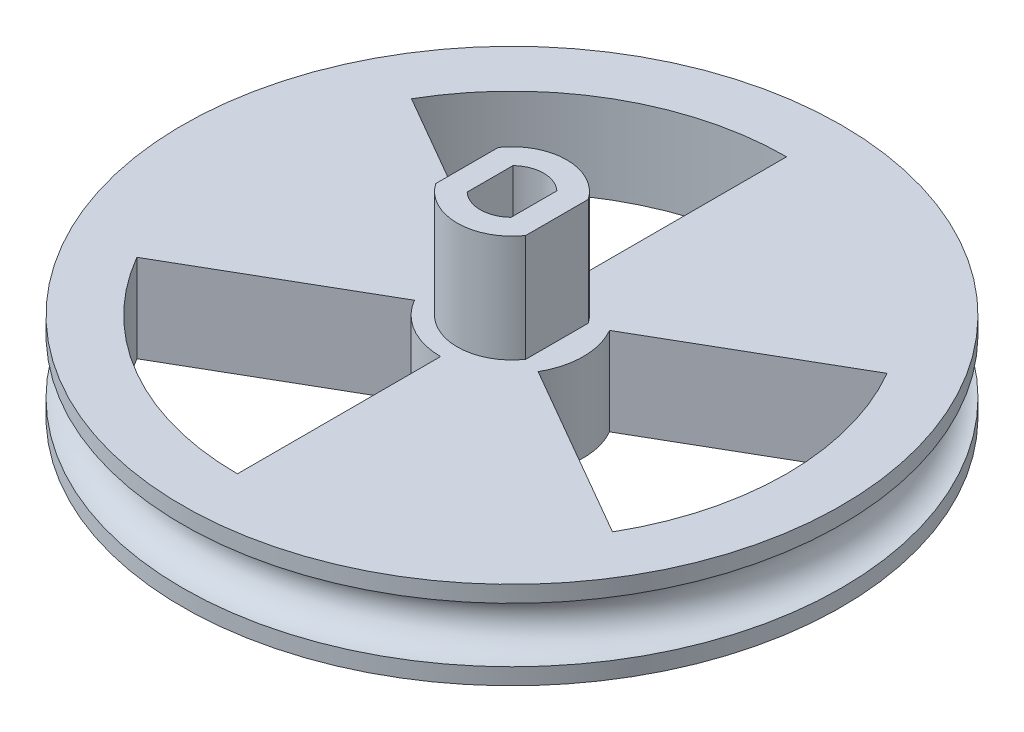
ISO-10303-21;
HEADER;
FILE_DESCRIPTION(('STEP AP214'),'2;1');
FILE_NAME('part.step','',(''),(''),'','','');
FILE_SCHEMA(('AUTOMOTIVE_DESIGN { 1 0 10303 214 1 1 1 1 }'));
ENDSEC;
DATA;
#1=APPLICATION_CONTEXT('core data for automotive mechanical design processes');
#2=APPLICATION_PROTOCOL_DEFINITION('international standard','automotive_design',2000,#1);
#3=PRODUCT_CONTEXT('',#1,'mechanical');
#4=PRODUCT('Part','Part','',(#3));
#5=PRODUCT_RELATED_PRODUCT_CATEGORY('part','',(#4));
#6=PRODUCT_DEFINITION_FORMATION('','',#4);
#7=PRODUCT_DEFINITION_CONTEXT('part definition',#1,'design');
#8=PRODUCT_DEFINITION('design','',#6,#7);
#9=PRODUCT_DEFINITION_SHAPE('','',#8);
#10=(LENGTH_UNIT() NAMED_UNIT(*) SI_UNIT(.MILLI.,.METRE.));
#11=(NAMED_UNIT(*) PLANE_ANGLE_UNIT() SI_UNIT($,.RADIAN.));
#12=(NAMED_UNIT(*) SI_UNIT($,.STERADIAN.) SOLID_ANGLE_UNIT());
#13=UNCERTAINTY_MEASURE_WITH_UNIT(LENGTH_MEASURE(1.E-05),#10,'distance_accuracy_value','');
#14=(GEOMETRIC_REPRESENTATION_CONTEXT(3) GLOBAL_UNCERTAINTY_ASSIGNED_CONTEXT((#13)) GLOBAL_UNIT_ASSIGNED_CONTEXT((#10,
#11,#12)) REPRESENTATION_CONTEXT('',''));
#15=CARTESIAN_POINT('',(0.,0.,0.));
#16=DIRECTION('',(0.,0.,1.));
#17=DIRECTION('',(1.,0.,0.));
#18=AXIS2_PLACEMENT_3D('',#15,#16,#17);
#19=CARTESIAN_POINT('',(0.,-8.,0.));
#20=DIRECTION('',(0.,1.,0.));
#21=DIRECTION('',(0.,0.,1.));
#22=AXIS2_PLACEMENT_3D('',#19,#20,#21);
#23=CYLINDRICAL_SURFACE('',#22,30.);
#24=CARTESIAN_POINT('',(0.,0.,0.));
#25=DIRECTION('',(0.,-1.,0.));
#26=DIRECTION('',(0.,0.,-1.));
#27=AXIS2_PLACEMENT_3D('',#24,#25,#26);
#28=CIRCLE('',#27,30.);
#29=CARTESIAN_POINT('',(0.,0.,-30.));
#30=VERTEX_POINT('',#29);
#31=EDGE_CURVE('E280',#30,#30,#28,.T.);
#32=ORIENTED_EDGE('',*,*,#31,.T.);
#33=EDGE_LOOP('',(#32));
#34=FACE_BOUND('',#33,.T.);
#35=CARTESIAN_POINT('',(0.,-1.5,0.));
#36=DIRECTION('',(0.,-1.,0.));
#37=DIRECTION('',(0.,0.,-1.));
#38=AXIS2_PLACEMENT_3D('',#35,#36,#37);
#39=CIRCLE('',#38,30.);
#40=CARTESIAN_POINT('',(0.,-1.5,-30.));
#41=VERTEX_POINT('',#40);
#42=EDGE_CURVE('E269',#41,#41,#39,.T.);
#43=ORIENTED_EDGE('',*,*,#42,.F.);
#44=EDGE_LOOP('',(#43));
#45=FACE_BOUND('',#44,.T.);
#46=ADVANCED_FACE('F36',(#34,#45),#23,.T.);
#47=CARTESIAN_POINT('',(-4.095,9.765,0.));
#48=DIRECTION('',(1.,0.,0.));
#49=DIRECTION('',(0.,0.,-1.));
#50=AXIS2_PLACEMENT_3D('',#47,#48,#49);
#51=PLANE('',#50);
#52=DIRECTION('',(0.,0.,1.));
#53=VECTOR('',#52,1.);
#54=CARTESIAN_POINT('',(-4.095,0.,0.));
#55=LINE('',#54,#53);
#56=CARTESIAN_POINT('',(-4.095,0.,-2.84712684122081));
#57=VERTEX_POINT('',#56);
#58=CARTESIAN_POINT('',(-4.095,0.,2.84712684122081));
#59=VERTEX_POINT('',#58);
#60=EDGE_CURVE('E307',#57,#59,#55,.T.);
#61=ORIENTED_EDGE('',*,*,#60,.T.);
#62=DIRECTION('',(0.,-1.,0.));
#63=VECTOR('',#62,1.);
#64=CARTESIAN_POINT('',(-4.095,9.765,2.84712684122081));
#65=LINE('',#64,#63);
#66=CARTESIAN_POINT('',(-4.095,9.765,2.84712684122081));
#67=VERTEX_POINT('',#66);
#68=EDGE_CURVE('E11',#67,#59,#65,.T.);
#69=ORIENTED_EDGE('',*,*,#68,.F.);
#70=DIRECTION('',(0.,0.,1.));
#71=VECTOR('',#70,1.);
#72=CARTESIAN_POINT('',(-4.095,9.765,0.));
#73=LINE('',#72,#71);
#74=CARTESIAN_POINT('',(-4.095,9.765,-2.84712684122081));
#75=VERTEX_POINT('',#74);
#76=EDGE_CURVE('E314',#75,#67,#73,.T.);
#77=ORIENTED_EDGE('',*,*,#76,.F.);
#78=DIRECTION('',(0.,-1.,0.));
#79=VECTOR('',#78,1.);
#80=CARTESIAN_POINT('',(-4.095,9.765,-2.84712684122081));
#81=LINE('',#80,#79);
#82=EDGE_CURVE('E325',#75,#57,#81,.T.);
#83=ORIENTED_EDGE('',*,*,#82,.T.);
#84=EDGE_LOOP('',(#61,#69,#77,#83));
#85=FACE_BOUND('',#84,.T.);
#86=ADVANCED_FACE('F38',(#85),#51,.F.);
#87=CARTESIAN_POINT('',(0.,9.765,0.));
#88=DIRECTION('',(0.,-1.,0.));
#89=DIRECTION('',(0.,0.,-1.));
#90=AXIS2_PLACEMENT_3D('',#87,#88,#89);
#91=CYLINDRICAL_SURFACE('',#90,4.9875);
#92=CARTESIAN_POINT('',(0.,0.,0.));
#93=DIRECTION('',(0.,1.,0.));
#94=DIRECTION('',(0.,0.,1.));
#95=AXIS2_PLACEMENT_3D('',#92,#93,#94);
#96=CIRCLE('',#95,4.9875);
#97=CARTESIAN_POINT('',(4.095,0.,2.84712684122081));
#98=VERTEX_POINT('',#97);
#99=EDGE_CURVE('E328',#59,#98,#96,.T.);
#100=ORIENTED_EDGE('',*,*,#99,.T.);
#101=DIRECTION('',(0.,-1.,0.));
#102=VECTOR('',#101,1.);
#103=CARTESIAN_POINT('',(4.095,9.765,2.84712684122081));
#104=LINE('',#103,#102);
#105=CARTESIAN_POINT('',(4.095,9.765,2.84712684122081));
#106=VERTEX_POINT('',#105);
#107=EDGE_CURVE('E45',#106,#98,#104,.T.);
#108=ORIENTED_EDGE('',*,*,#107,.F.);
#109=CARTESIAN_POINT('',(0.,9.765,0.));
#110=DIRECTION('',(0.,1.,0.));
#111=DIRECTION('',(0.,0.,1.));
#112=AXIS2_PLACEMENT_3D('',#109,#110,#111);
#113=CIRCLE('',#112,4.9875);
#114=EDGE_CURVE('E317',#67,#106,#113,.T.);
#115=ORIENTED_EDGE('',*,*,#114,.F.);
#116=ORIENTED_EDGE('',*,*,#68,.T.);
#117=EDGE_LOOP('',(#100,#108,#115,#116));
#118=FACE_BOUND('',#117,.T.);
#119=ADVANCED_FACE('F372',(#118),#91,.T.);
#120=CARTESIAN_POINT('',(4.095,9.765,0.));
#121=DIRECTION('',(1.,0.,0.));
#122=DIRECTION('',(0.,0.,-1.));
#123=AXIS2_PLACEMENT_3D('',#120,#121,#122);
#124=PLANE('',#123);
#125=DIRECTION('',(0.,0.,1.));
#126=VECTOR('',#125,1.);
#127=CARTESIAN_POINT('',(4.095,0.,0.));
#128=LINE('',#127,#126);
#129=CARTESIAN_POINT('',(4.095,0.,-2.84712684122081));
#130=VERTEX_POINT('',#129);
#131=EDGE_CURVE('E331',#130,#98,#128,.T.);
#132=ORIENTED_EDGE('',*,*,#131,.F.);
#133=DIRECTION('',(0.,-1.,0.));
#134=VECTOR('',#133,1.);
#135=CARTESIAN_POINT('',(4.095,9.765,-2.84712684122081));
#136=LINE('',#135,#134);
#137=CARTESIAN_POINT('',(4.095,9.765,-2.84712684122081));
#138=VERTEX_POINT('',#137);
#139=EDGE_CURVE('E337',#138,#130,#136,.T.);
#140=ORIENTED_EDGE('',*,*,#139,.F.);
#141=DIRECTION('',(0.,0.,1.));
#142=VECTOR('',#141,1.);
#143=CARTESIAN_POINT('',(4.095,9.765,0.));
#144=LINE('',#143,#142);
#145=EDGE_CURVE('E320',#138,#106,#144,.T.);
#146=ORIENTED_EDGE('',*,*,#145,.T.);
#147=ORIENTED_EDGE('',*,*,#107,.T.);
#148=EDGE_LOOP('',(#132,#140,#146,#147));
#149=FACE_BOUND('',#148,.T.);
#150=ADVANCED_FACE('F391',(#149),#124,.T.);
#151=CARTESIAN_POINT('',(0.,9.765,0.));
#152=DIRECTION('',(0.,-1.,0.));
#153=DIRECTION('',(0.,0.,-1.));
#154=AXIS2_PLACEMENT_3D('',#151,#152,#153);
#155=CYLINDRICAL_SURFACE('',#154,4.9875);
#156=CARTESIAN_POINT('',(0.,0.,0.));
#157=DIRECTION('',(0.,1.,0.));
#158=DIRECTION('',(0.,0.,1.));
#159=AXIS2_PLACEMENT_3D('',#156,#157,#158);
#160=CIRCLE('',#159,4.9875);
#161=EDGE_CURVE('E318',#130,#57,#160,.T.);
#162=ORIENTED_EDGE('',*,*,#161,.T.);
#163=ORIENTED_EDGE('',*,*,#82,.F.);
#164=CARTESIAN_POINT('',(0.,9.765,0.));
#165=DIRECTION('',(0.,1.,0.));
#166=DIRECTION('',(0.,0.,1.));
#167=AXIS2_PLACEMENT_3D('',#164,#165,#166);
#168=CIRCLE('',#167,4.9875);
#169=EDGE_CURVE('E323',#138,#75,#168,.T.);
#170=ORIENTED_EDGE('',*,*,#169,.F.);
#171=ORIENTED_EDGE('',*,*,#139,.T.);
#172=EDGE_LOOP('',(#162,#163,#170,#171));
#173=FACE_BOUND('',#172,.T.);
#174=ADVANCED_FACE('F388',(#173),#155,.T.);
#175=CARTESIAN_POINT('',(-11.1209924240492,9.765,0.));
#176=DIRECTION('',(0.,1.,0.));
#177=DIRECTION('',(0.,0.,1.));
#178=AXIS2_PLACEMENT_3D('',#175,#176,#177);
#179=PLANE('',#178);
#180=DIRECTION('',(0.,0.,-1.));
#181=VECTOR('',#180,1.);
#182=CARTESIAN_POINT('',(1.995,9.765,0.));
#183=LINE('',#182,#181);
#184=CARTESIAN_POINT('',(1.995,9.765,2.08749401196746));
#185=VERTEX_POINT('',#184);
#186=CARTESIAN_POINT('',(1.995,9.765,-2.08749401196746));
#187=VERTEX_POINT('',#186);
#188=EDGE_CURVE('E279',#185,#187,#183,.T.);
#189=ORIENTED_EDGE('',*,*,#188,.F.);
#190=CARTESIAN_POINT('',(0.,9.765,0.));
#191=DIRECTION('',(0.,1.,0.));
#192=DIRECTION('',(0.,0.,1.));
#193=AXIS2_PLACEMENT_3D('',#190,#191,#192);
#194=CIRCLE('',#193,2.8875);
#195=CARTESIAN_POINT('',(-1.995,9.765,2.08749401196746));
#196=VERTEX_POINT('',#195);
#197=EDGE_CURVE('E287',#196,#185,#194,.T.);
#198=ORIENTED_EDGE('',*,*,#197,.F.);
#199=DIRECTION('',(0.,0.,-1.));
#200=VECTOR('',#199,1.);
#201=CARTESIAN_POINT('',(-1.995,9.765,0.));
#202=LINE('',#201,#200);
#203=CARTESIAN_POINT('',(-1.995,9.765,-2.08749401196746));
#204=VERTEX_POINT('',#203);
#205=EDGE_CURVE('E300',#196,#204,#202,.T.);
#206=ORIENTED_EDGE('',*,*,#205,.T.);
#207=CARTESIAN_POINT('',(0.,9.765,0.));
#208=DIRECTION('',(0.,1.,0.));
#209=DIRECTION('',(0.,0.,1.));
#210=AXIS2_PLACEMENT_3D('',#207,#208,#209);
#211=CIRCLE('',#210,2.8875);
#212=EDGE_CURVE('E297',#187,#204,#211,.T.);
#213=ORIENTED_EDGE('',*,*,#212,.F.);
#214=EDGE_LOOP('',(#189,#198,#206,#213));
#215=FACE_BOUND('',#214,.T.);
#216=ORIENTED_EDGE('',*,*,#76,.T.);
#217=ORIENTED_EDGE('',*,*,#114,.T.);
#218=ORIENTED_EDGE('',*,*,#145,.F.);
#219=ORIENTED_EDGE('',*,*,#169,.T.);
#220=EDGE_LOOP('',(#216,#217,#218,#219));
#221=FACE_BOUND('',#220,.T.);
#222=ADVANCED_FACE('F393',(#215,#221),#179,.T.);
#223=CARTESIAN_POINT('',(1.995,2.1,0.));
#224=DIRECTION('',(1.,0.,0.));
#225=DIRECTION('',(0.,0.,-1.));
#226=AXIS2_PLACEMENT_3D('',#223,#224,#225);
#227=PLANE('',#226);
#228=ORIENTED_EDGE('',*,*,#188,.T.);
#229=DIRECTION('',(0.,1.,0.));
#230=VECTOR('',#229,1.);
#231=CARTESIAN_POINT('',(1.995,2.1,-2.08749401196746));
#232=LINE('',#231,#230);
#233=CARTESIAN_POINT('',(1.995,2.1,-2.08749401196746));
#234=VERTEX_POINT('',#233);
#235=EDGE_CURVE('E295',#234,#187,#232,.T.);
#236=ORIENTED_EDGE('',*,*,#235,.F.);
#237=DIRECTION('',(0.,0.,-1.));
#238=VECTOR('',#237,1.);
#239=CARTESIAN_POINT('',(1.995,2.1,0.));
#240=LINE('',#239,#238);
#241=CARTESIAN_POINT('',(1.995,2.1,2.08749401196746));
#242=VERTEX_POINT('',#241);
#243=EDGE_CURVE('E283',#242,#234,#240,.T.);
#244=ORIENTED_EDGE('',*,*,#243,.F.);
#245=DIRECTION('',(0.,1.,0.));
#246=VECTOR('',#245,1.);
#247=CARTESIAN_POINT('',(1.995,2.1,2.08749401196746));
#248=LINE('',#247,#246);
#249=EDGE_CURVE('E305',#242,#185,#248,.T.);
#250=ORIENTED_EDGE('',*,*,#249,.T.);
#251=EDGE_LOOP('',(#228,#236,#244,#250));
#252=FACE_BOUND('',#251,.T.);
#253=ADVANCED_FACE('F395',(#252),#227,.F.);
#254=CARTESIAN_POINT('',(0.,2.1,0.));
#255=DIRECTION('',(0.,1.,0.));
#256=DIRECTION('',(0.,0.,1.));
#257=AXIS2_PLACEMENT_3D('',#254,#255,#256);
#258=CYLINDRICAL_SURFACE('',#257,2.8875);
#259=ORIENTED_EDGE('',*,*,#197,.T.);
#260=ORIENTED_EDGE('',*,*,#249,.F.);
#261=CARTESIAN_POINT('',(0.,2.1,0.));
#262=DIRECTION('',(0.,1.,0.));
#263=DIRECTION('',(0.,0.,1.));
#264=AXIS2_PLACEMENT_3D('',#261,#262,#263);
#265=CIRCLE('',#264,2.8875);
#266=CARTESIAN_POINT('',(-1.995,2.1,2.08749401196746));
#267=VERTEX_POINT('',#266);
#268=EDGE_CURVE('E292',#267,#242,#265,.T.);
#269=ORIENTED_EDGE('',*,*,#268,.F.);
#270=DIRECTION('',(0.,1.,0.));
#271=VECTOR('',#270,1.);
#272=CARTESIAN_POINT('',(-1.995,2.1,2.08749401196746));
#273=LINE('',#272,#271);
#274=EDGE_CURVE('E308',#267,#196,#273,.T.);
#275=ORIENTED_EDGE('',*,*,#274,.T.);
#276=EDGE_LOOP('',(#259,#260,#269,#275));
#277=FACE_BOUND('',#276,.T.);
#278=ADVANCED_FACE('F402',(#277),#258,.F.);
#279=CARTESIAN_POINT('',(-1.995,2.1,0.));
#280=DIRECTION('',(1.,0.,0.));
#281=DIRECTION('',(0.,0.,-1.));
#282=AXIS2_PLACEMENT_3D('',#279,#280,#281);
#283=PLANE('',#282);
#284=ORIENTED_EDGE('',*,*,#205,.F.);
#285=ORIENTED_EDGE('',*,*,#274,.F.);
#286=DIRECTION('',(0.,0.,-1.));
#287=VECTOR('',#286,1.);
#288=CARTESIAN_POINT('',(-1.995,2.1,0.));
#289=LINE('',#288,#287);
#290=CARTESIAN_POINT('',(-1.995,2.1,-2.08749401196746));
#291=VERTEX_POINT('',#290);
#292=EDGE_CURVE('E290',#267,#291,#289,.T.);
#293=ORIENTED_EDGE('',*,*,#292,.T.);
#294=DIRECTION('',(0.,1.,0.));
#295=VECTOR('',#294,1.);
#296=CARTESIAN_POINT('',(-1.995,2.1,-2.08749401196746));
#297=LINE('',#296,#295);
#298=EDGE_CURVE('E310',#291,#204,#297,.T.);
#299=ORIENTED_EDGE('',*,*,#298,.T.);
#300=EDGE_LOOP('',(#284,#285,#293,#299));
#301=FACE_BOUND('',#300,.T.);
#302=ADVANCED_FACE('F600',(#301),#283,.T.);
#303=CARTESIAN_POINT('',(0.,2.1,0.));
#304=DIRECTION('',(0.,1.,0.));
#305=DIRECTION('',(0.,0.,1.));
#306=AXIS2_PLACEMENT_3D('',#303,#304,#305);
#307=CYLINDRICAL_SURFACE('',#306,2.8875);
#308=ORIENTED_EDGE('',*,*,#212,.T.);
#309=ORIENTED_EDGE('',*,*,#298,.F.);
#310=CARTESIAN_POINT('',(0.,2.1,0.));
#311=DIRECTION('',(0.,1.,0.));
#312=DIRECTION('',(0.,0.,1.));
#313=AXIS2_PLACEMENT_3D('',#310,#311,#312);
#314=CIRCLE('',#313,2.8875);
#315=EDGE_CURVE('E286',#234,#291,#314,.T.);
#316=ORIENTED_EDGE('',*,*,#315,.F.);
#317=ORIENTED_EDGE('',*,*,#235,.T.);
#318=EDGE_LOOP('',(#308,#309,#316,#317));
#319=FACE_BOUND('',#318,.T.);
#320=ADVANCED_FACE('F594',(#319),#307,.F.);
#321=CARTESIAN_POINT('',(-10.1873628099542,2.1,0.));
#322=DIRECTION('',(0.,1.,0.));
#323=DIRECTION('',(0.,0.,1.));
#324=AXIS2_PLACEMENT_3D('',#321,#322,#323);
#325=PLANE('',#324);
#326=ORIENTED_EDGE('',*,*,#243,.T.);
#327=ORIENTED_EDGE('',*,*,#315,.T.);
#328=ORIENTED_EDGE('',*,*,#292,.F.);
#329=ORIENTED_EDGE('',*,*,#268,.T.);
#330=EDGE_LOOP('',(#326,#327,#328,#329));
#331=FACE_BOUND('',#330,.T.);
#332=ADVANCED_FACE('F379',(#331),#325,.T.);
#333=CARTESIAN_POINT('',(0.,0.,0.));
#334=DIRECTION('',(0.,-1.,0.));
#335=DIRECTION('',(0.,0.,-1.));
#336=AXIS2_PLACEMENT_3D('',#333,#334,#335);
#337=PLANE('',#336);
#338=DIRECTION('',(0.866025403784448,0.,-0.499999999999984));
#339=VECTOR('',#338,1.);
#340=CARTESIAN_POINT('',(21.6506350946111,0.,-12.4999999999998));
#341=LINE('',#340,#339);
#342=CARTESIAN_POINT('',(5.62916512459879,0.,-3.2500000000001));
#343=VERTEX_POINT('',#342);
#344=CARTESIAN_POINT('',(21.6506350946111,0.,-12.4999999999998));
#345=VERTEX_POINT('',#344);
#346=EDGE_CURVE('E183',#343,#345,#341,.T.);
#347=ORIENTED_EDGE('',*,*,#346,.T.);
#348=CARTESIAN_POINT('',(0.,0.,0.));
#349=DIRECTION('',(0.,-1.,0.));
#350=DIRECTION('',(0.,0.,-1.));
#351=AXIS2_PLACEMENT_3D('',#348,#349,#350);
#352=CIRCLE('',#351,25.);
#353=CARTESIAN_POINT('',(21.6506350946108,0.,12.5000000000003));
#354=VERTEX_POINT('',#353);
#355=EDGE_CURVE('E177',#345,#354,#352,.T.);
#356=ORIENTED_EDGE('',*,*,#355,.T.);
#357=DIRECTION('',(-0.866025403784435,0.,-0.500000000000007));
#358=VECTOR('',#357,1.);
#359=CARTESIAN_POINT('',(21.6506350946108,0.,12.5000000000003));
#360=LINE('',#359,#358);
#361=CARTESIAN_POINT('',(5.62916512459878,0.,3.25000000000013));
#362=VERTEX_POINT('',#361);
#363=EDGE_CURVE('E186',#354,#362,#360,.T.);
#364=ORIENTED_EDGE('',*,*,#363,.T.);
#365=CARTESIAN_POINT('',(0.,0.,0.));
#366=DIRECTION('',(0.,1.,0.));
#367=DIRECTION('',(0.,0.,-1.));
#368=AXIS2_PLACEMENT_3D('',#365,#366,#367);
#369=CIRCLE('',#368,6.5);
#370=EDGE_CURVE('E53',#362,#343,#369,.T.);
#371=ORIENTED_EDGE('',*,*,#370,.T.);
#372=EDGE_LOOP('',(#347,#356,#364,#371));
#373=FACE_BOUND('',#372,.T.);
#374=DIRECTION('',(-0.866025403784433,0.,-0.50000000000001));
#375=VECTOR('',#374,1.);
#376=CARTESIAN_POINT('',(-21.6506350946109,0.,-12.5000000000001));
#377=LINE('',#376,#375);
#378=CARTESIAN_POINT('',(-5.6291651245989,0.,-3.24999999999992));
#379=VERTEX_POINT('',#378);
#380=CARTESIAN_POINT('',(-21.6506350946109,0.,-12.5000000000001));
#381=VERTEX_POINT('',#380);
#382=EDGE_CURVE('E222',#379,#381,#377,.T.);
#383=ORIENTED_EDGE('',*,*,#382,.T.);
#384=CARTESIAN_POINT('',(0.,0.,0.));
#385=DIRECTION('',(0.,-1.,0.));
#386=DIRECTION('',(0.,0.,-1.));
#387=AXIS2_PLACEMENT_3D('',#384,#385,#386);
#388=CIRCLE('',#387,25.);
#389=CARTESIAN_POINT('',(1.74574066942157E-13,0.,-25.));
#390=VERTEX_POINT('',#389);
#391=EDGE_CURVE('E212',#381,#390,#388,.T.);
#392=ORIENTED_EDGE('',*,*,#391,.T.);
#393=DIRECTION('',(0.,0.,1.));
#394=VECTOR('',#393,1.);
#395=CARTESIAN_POINT('',(1.74574066942157E-13,0.,-25.));
#396=LINE('',#395,#394);
#397=CARTESIAN_POINT('',(0.,0.,-6.5));
#398=VERTEX_POINT('',#397);
#399=EDGE_CURVE('E215',#390,#398,#396,.T.);
#400=ORIENTED_EDGE('',*,*,#399,.T.);
#401=CARTESIAN_POINT('',(0.,0.,0.));
#402=DIRECTION('',(0.,1.,0.));
#403=DIRECTION('',(0.,0.,-1.));
#404=AXIS2_PLACEMENT_3D('',#401,#402,#403);
#405=CIRCLE('',#404,6.5);
#406=EDGE_CURVE('E219',#398,#379,#405,.T.);
#407=ORIENTED_EDGE('',*,*,#406,.T.);
#408=EDGE_LOOP('',(#383,#392,#400,#407));
#409=FACE_BOUND('',#408,.T.);
#410=DIRECTION('',(0.,0.,1.));
#411=VECTOR('',#410,1.);
#412=CARTESIAN_POINT('',(0.,0.,6.5));
#413=LINE('',#412,#411);
#414=CARTESIAN_POINT('',(0.,0.,6.5));
#415=VERTEX_POINT('',#414);
#416=CARTESIAN_POINT('',(0.,0.,25.));
#417=VERTEX_POINT('',#416);
#418=EDGE_CURVE('E254',#415,#417,#413,.T.);
#419=ORIENTED_EDGE('',*,*,#418,.T.);
#420=CARTESIAN_POINT('',(0.,0.,0.));
#421=DIRECTION('',(0.,-1.,0.));
#422=DIRECTION('',(0.,0.,-1.));
#423=AXIS2_PLACEMENT_3D('',#420,#421,#422);
#424=CIRCLE('',#423,25.);
#425=CARTESIAN_POINT('',(-21.650635094611,0.,12.5));
#426=VERTEX_POINT('',#425);
#427=EDGE_CURVE('E244',#417,#426,#424,.T.);
#428=ORIENTED_EDGE('',*,*,#427,.T.);
#429=DIRECTION('',(0.866025403784438,0.,-0.5));
#430=VECTOR('',#429,1.);
#431=CARTESIAN_POINT('',(-21.650635094611,0.,12.5));
#432=LINE('',#431,#430);
#433=CARTESIAN_POINT('',(-5.62916512459888,0.,3.24999999999994));
#434=VERTEX_POINT('',#433);
#435=EDGE_CURVE('E247',#426,#434,#432,.T.);
#436=ORIENTED_EDGE('',*,*,#435,.T.);
#437=CARTESIAN_POINT('',(0.,0.,0.));
#438=DIRECTION('',(0.,1.,0.));
#439=DIRECTION('',(0.,0.,-1.));
#440=AXIS2_PLACEMENT_3D('',#437,#438,#439);
#441=CIRCLE('',#440,6.5);
#442=EDGE_CURVE('E251',#434,#415,#441,.T.);
#443=ORIENTED_EDGE('',*,*,#442,.T.);
#444=EDGE_LOOP('',(#419,#428,#436,#443));
#445=FACE_BOUND('',#444,.T.);
#446=ORIENTED_EDGE('',*,*,#31,.F.);
#447=EDGE_LOOP('',(#446));
#448=FACE_BOUND('',#447,.T.);
#449=ORIENTED_EDGE('',*,*,#99,.F.);
#450=ORIENTED_EDGE('',*,*,#60,.F.);
#451=ORIENTED_EDGE('',*,*,#161,.F.);
#452=ORIENTED_EDGE('',*,*,#131,.T.);
#453=EDGE_LOOP('',(#449,#450,#451,#452));
#454=FACE_BOUND('',#453,.T.);
#455=ADVANCED_FACE('F190',(#373,#409,#445,#448,#454),#337,.F.);
#456=CARTESIAN_POINT('',(0.,-4.,0.));
#457=DIRECTION('',(0.,-1.,0.));
#458=DIRECTION('',(0.,0.,-1.));
#459=AXIS2_PLACEMENT_3D('',#456,#457,#458);
#460=TOROIDAL_SURFACE('',#459,30.,2.5);
#461=ORIENTED_EDGE('',*,*,#42,.T.);
#462=EDGE_LOOP('',(#461));
#463=FACE_BOUND('',#462,.T.);
#464=CARTESIAN_POINT('',(0.,-6.5,0.));
#465=DIRECTION('',(0.,1.,0.));
#466=DIRECTION('',(0.,0.,1.));
#467=AXIS2_PLACEMENT_3D('',#464,#465,#466);
#468=CIRCLE('',#467,30.);
#469=CARTESIAN_POINT('',(0.,-6.5,30.));
#470=VERTEX_POINT('',#469);
#471=EDGE_CURVE('E40',#470,#470,#468,.T.);
#472=ORIENTED_EDGE('',*,*,#471,.T.);
#473=EDGE_LOOP('',(#472));
#474=FACE_BOUND('',#473,.T.);
#475=ADVANCED_FACE('F347',(#463,#474),#460,.F.);
#476=CARTESIAN_POINT('',(0.,-8.,0.));
#477=DIRECTION('',(0.,-1.,0.));
#478=DIRECTION('',(0.,0.,-1.));
#479=AXIS2_PLACEMENT_3D('',#476,#477,#478);
#480=PLANE('',#479);
#481=CARTESIAN_POINT('',(0.,-8.,0.));
#482=DIRECTION('',(0.,-1.,0.));
#483=DIRECTION('',(0.,0.,-1.));
#484=AXIS2_PLACEMENT_3D('',#481,#482,#483);
#485=CIRCLE('',#484,25.);
#486=CARTESIAN_POINT('',(21.6506350946111,-8.,-12.4999999999998));
#487=VERTEX_POINT('',#486);
#488=CARTESIAN_POINT('',(21.6506350946108,-8.,12.5000000000003));
#489=VERTEX_POINT('',#488);
#490=EDGE_CURVE('E61',#487,#489,#485,.T.);
#491=ORIENTED_EDGE('',*,*,#490,.F.);
#492=DIRECTION('',(0.866025403784448,0.,-0.499999999999984));
#493=VECTOR('',#492,1.);
#494=CARTESIAN_POINT('',(21.6506350946111,-8.,-12.4999999999998));
#495=LINE('',#494,#493);
#496=CARTESIAN_POINT('',(5.62916512459879,-8.,-3.2500000000001));
#497=VERTEX_POINT('',#496);
#498=EDGE_CURVE('E193',#497,#487,#495,.T.);
#499=ORIENTED_EDGE('',*,*,#498,.F.);
#500=CARTESIAN_POINT('',(0.,-8.,0.));
#501=DIRECTION('',(0.,1.,0.));
#502=DIRECTION('',(0.,0.,-1.));
#503=AXIS2_PLACEMENT_3D('',#500,#501,#502);
#504=CIRCLE('',#503,6.5);
#505=CARTESIAN_POINT('',(5.62916512459878,-8.,3.25000000000013));
#506=VERTEX_POINT('',#505);
#507=EDGE_CURVE('E196',#506,#497,#504,.T.);
#508=ORIENTED_EDGE('',*,*,#507,.F.);
#509=DIRECTION('',(-0.866025403784435,0.,-0.500000000000007));
#510=VECTOR('',#509,1.);
#511=CARTESIAN_POINT('',(21.6506350946108,-8.,12.5000000000003));
#512=LINE('',#511,#510);
#513=EDGE_CURVE('E202',#489,#506,#512,.T.);
#514=ORIENTED_EDGE('',*,*,#513,.F.);
#515=EDGE_LOOP('',(#491,#499,#508,#514));
#516=FACE_BOUND('',#515,.T.);
#517=CARTESIAN_POINT('',(0.,-8.,0.));
#518=DIRECTION('',(0.,-1.,0.));
#519=DIRECTION('',(0.,0.,-1.));
#520=AXIS2_PLACEMENT_3D('',#517,#518,#519);
#521=CIRCLE('',#520,25.);
#522=CARTESIAN_POINT('',(-21.6506350946109,-8.,-12.5000000000001));
#523=VERTEX_POINT('',#522);
#524=CARTESIAN_POINT('',(1.74574066942157E-13,-8.,-25.));
#525=VERTEX_POINT('',#524);
#526=EDGE_CURVE('E208',#523,#525,#521,.T.);
#527=ORIENTED_EDGE('',*,*,#526,.F.);
#528=DIRECTION('',(-0.866025403784433,0.,-0.50000000000001));
#529=VECTOR('',#528,1.);
#530=CARTESIAN_POINT('',(-21.6506350946109,-8.,-12.5000000000001));
#531=LINE('',#530,#529);
#532=CARTESIAN_POINT('',(-5.6291651245989,-8.,-3.24999999999992));
#533=VERTEX_POINT('',#532);
#534=EDGE_CURVE('E216',#533,#523,#531,.T.);
#535=ORIENTED_EDGE('',*,*,#534,.F.);
#536=CARTESIAN_POINT('',(0.,-8.,0.));
#537=DIRECTION('',(0.,1.,0.));
#538=DIRECTION('',(0.,0.,-1.));
#539=AXIS2_PLACEMENT_3D('',#536,#537,#538);
#540=CIRCLE('',#539,6.5);
#541=CARTESIAN_POINT('',(0.,-8.,-6.5));
#542=VERTEX_POINT('',#541);
#543=EDGE_CURVE('E230',#542,#533,#540,.T.);
#544=ORIENTED_EDGE('',*,*,#543,.F.);
#545=DIRECTION('',(0.,0.,1.));
#546=VECTOR('',#545,1.);
#547=CARTESIAN_POINT('',(1.74574066942157E-13,-8.,-25.));
#548=LINE('',#547,#546);
#549=EDGE_CURVE('E227',#525,#542,#548,.T.);
#550=ORIENTED_EDGE('',*,*,#549,.F.);
#551=EDGE_LOOP('',(#527,#535,#544,#550));
#552=FACE_BOUND('',#551,.T.);
#553=CARTESIAN_POINT('',(0.,-8.,0.));
#554=DIRECTION('',(0.,-1.,0.));
#555=DIRECTION('',(0.,0.,-1.));
#556=AXIS2_PLACEMENT_3D('',#553,#554,#555);
#557=CIRCLE('',#556,25.);
#558=CARTESIAN_POINT('',(0.,-8.,25.));
#559=VERTEX_POINT('',#558);
#560=CARTESIAN_POINT('',(-21.650635094611,-8.,12.5));
#561=VERTEX_POINT('',#560);
#562=EDGE_CURVE('E237',#559,#561,#557,.T.);
#563=ORIENTED_EDGE('',*,*,#562,.F.);
#564=DIRECTION('',(0.,0.,1.));
#565=VECTOR('',#564,1.);
#566=CARTESIAN_POINT('',(0.,-8.,6.5));
#567=LINE('',#566,#565);
#568=CARTESIAN_POINT('',(0.,-8.,6.5));
#569=VERTEX_POINT('',#568);
#570=EDGE_CURVE('E248',#569,#559,#567,.T.);
#571=ORIENTED_EDGE('',*,*,#570,.F.);
#572=CARTESIAN_POINT('',(0.,-8.,0.));
#573=DIRECTION('',(0.,1.,0.));
#574=DIRECTION('',(0.,0.,-1.));
#575=AXIS2_PLACEMENT_3D('',#572,#573,#574);
#576=CIRCLE('',#575,6.5);
#577=CARTESIAN_POINT('',(-5.62916512459888,-8.,3.24999999999995));
#578=VERTEX_POINT('',#577);
#579=EDGE_CURVE('E262',#578,#569,#576,.T.);
#580=ORIENTED_EDGE('',*,*,#579,.F.);
#581=DIRECTION('',(0.866025403784438,0.,-0.5));
#582=VECTOR('',#581,1.);
#583=CARTESIAN_POINT('',(-21.650635094611,-8.,12.5));
#584=LINE('',#583,#582);
#585=EDGE_CURVE('E259',#561,#578,#584,.T.);
#586=ORIENTED_EDGE('',*,*,#585,.F.);
#587=EDGE_LOOP('',(#563,#571,#580,#586));
#588=FACE_BOUND('',#587,.T.);
#589=CARTESIAN_POINT('',(0.,-8.,0.));
#590=DIRECTION('',(0.,-1.,0.));
#591=DIRECTION('',(0.,0.,-1.));
#592=AXIS2_PLACEMENT_3D('',#589,#590,#591);
#593=CIRCLE('',#592,30.);
#594=CARTESIAN_POINT('',(0.,-8.,-30.));
#595=VERTEX_POINT('',#594);
#596=EDGE_CURVE('E276',#595,#595,#593,.T.);
#597=ORIENTED_EDGE('',*,*,#596,.T.);
#598=EDGE_LOOP('',(#597));
#599=FACE_BOUND('',#598,.T.);
#600=ADVANCED_FACE('F352',(#516,#552,#588,#599),#480,.T.);
#601=ORIENTED_EDGE('',*,*,#596,.F.);
#602=EDGE_LOOP('',(#601));
#603=FACE_BOUND('',#602,.T.);
#604=ORIENTED_EDGE('',*,*,#471,.F.);
#605=EDGE_LOOP('',(#604));
#606=FACE_BOUND('',#605,.T.);
#607=ADVANCED_FACE('F349',(#603,#606),#23,.T.);
#608=CARTESIAN_POINT('',(0.,0.,0.));
#609=DIRECTION('',(0.,-1.,0.));
#610=DIRECTION('',(0.,0.,-1.));
#611=AXIS2_PLACEMENT_3D('',#608,#609,#610);
#612=CYLINDRICAL_SURFACE('',#611,25.);
#613=ORIENTED_EDGE('',*,*,#562,.T.);
#614=DIRECTION('',(0.,-1.,0.));
#615=VECTOR('',#614,1.);
#616=CARTESIAN_POINT('',(-21.650635094611,0.,12.5));
#617=LINE('',#616,#615);
#618=EDGE_CURVE('E257',#426,#561,#617,.T.);
#619=ORIENTED_EDGE('',*,*,#618,.F.);
#620=ORIENTED_EDGE('',*,*,#427,.F.);
#621=DIRECTION('',(0.,-1.,0.));
#622=VECTOR('',#621,1.);
#623=CARTESIAN_POINT('',(0.,0.,25.));
#624=LINE('',#623,#622);
#625=EDGE_CURVE('E267',#417,#559,#624,.T.);
#626=ORIENTED_EDGE('',*,*,#625,.T.);
#627=EDGE_LOOP('',(#613,#619,#620,#626));
#628=FACE_BOUND('',#627,.T.);
#629=ADVANCED_FACE('F351',(#628),#612,.F.);
#630=CARTESIAN_POINT('',(0.,0.,6.5));
#631=DIRECTION('',(1.,0.,0.));
#632=DIRECTION('',(0.,0.,-1.));
#633=AXIS2_PLACEMENT_3D('',#630,#631,#632);
#634=PLANE('',#633);
#635=ORIENTED_EDGE('',*,*,#570,.T.);
#636=ORIENTED_EDGE('',*,*,#625,.F.);
#637=ORIENTED_EDGE('',*,*,#418,.F.);
#638=DIRECTION('',(0.,-1.,0.));
#639=VECTOR('',#638,1.);
#640=CARTESIAN_POINT('',(0.,0.,6.5));
#641=LINE('',#640,#639);
#642=EDGE_CURVE('E270',#415,#569,#641,.T.);
#643=ORIENTED_EDGE('',*,*,#642,.T.);
#644=EDGE_LOOP('',(#635,#636,#637,#643));
#645=FACE_BOUND('',#644,.T.);
#646=ADVANCED_FACE('F359',(#645),#634,.F.);
#647=CARTESIAN_POINT('',(0.,0.,0.));
#648=DIRECTION('',(0.,-1.,0.));
#649=DIRECTION('',(0.,0.,-1.));
#650=AXIS2_PLACEMENT_3D('',#647,#648,#649);
#651=CYLINDRICAL_SURFACE('',#650,6.5);
#652=ORIENTED_EDGE('',*,*,#579,.T.);
#653=ORIENTED_EDGE('',*,*,#642,.F.);
#654=ORIENTED_EDGE('',*,*,#442,.F.);
#655=DIRECTION('',(0.,-1.,0.));
#656=VECTOR('',#655,1.);
#657=CARTESIAN_POINT('',(-5.62916512459888,0.,3.24999999999995));
#658=LINE('',#657,#656);
#659=EDGE_CURVE('E272',#434,#578,#658,.T.);
#660=ORIENTED_EDGE('',*,*,#659,.T.);
#661=EDGE_LOOP('',(#652,#653,#654,#660));
#662=FACE_BOUND('',#661,.T.);
#663=ADVANCED_FACE('F470',(#662),#651,.T.);
#664=CARTESIAN_POINT('',(-21.650635094611,0.,12.5));
#665=DIRECTION('',(-0.5,0.,-0.866025403784439));
#666=DIRECTION('',(-0.866025403784439,0.,0.5));
#667=AXIS2_PLACEMENT_3D('',#664,#665,#666);
#668=PLANE('',#667);
#669=ORIENTED_EDGE('',*,*,#585,.T.);
#670=ORIENTED_EDGE('',*,*,#659,.F.);
#671=ORIENTED_EDGE('',*,*,#435,.F.);
#672=ORIENTED_EDGE('',*,*,#618,.T.);
#673=EDGE_LOOP('',(#669,#670,#671,#672));
#674=FACE_BOUND('',#673,.T.);
#675=ADVANCED_FACE('F480',(#674),#668,.F.);
#676=CARTESIAN_POINT('',(0.,0.,0.));
#677=DIRECTION('',(0.,-1.,0.));
#678=DIRECTION('',(0.,0.,-1.));
#679=AXIS2_PLACEMENT_3D('',#676,#677,#678);
#680=CYLINDRICAL_SURFACE('',#679,25.);
#681=ORIENTED_EDGE('',*,*,#526,.T.);
#682=DIRECTION('',(0.,-1.,0.));
#683=VECTOR('',#682,1.);
#684=CARTESIAN_POINT('',(1.74574066942157E-13,0.,-25.));
#685=LINE('',#684,#683);
#686=EDGE_CURVE('E225',#390,#525,#685,.T.);
#687=ORIENTED_EDGE('',*,*,#686,.F.);
#688=ORIENTED_EDGE('',*,*,#391,.F.);
#689=DIRECTION('',(0.,-1.,0.));
#690=VECTOR('',#689,1.);
#691=CARTESIAN_POINT('',(-21.6506350946109,0.,-12.5000000000001));
#692=LINE('',#691,#690);
#693=EDGE_CURVE('E235',#381,#523,#692,.T.);
#694=ORIENTED_EDGE('',*,*,#693,.T.);
#695=EDGE_LOOP('',(#681,#687,#688,#694));
#696=FACE_BOUND('',#695,.T.);
#697=ADVANCED_FACE('F490',(#696),#680,.F.);
#698=CARTESIAN_POINT('',(-21.6506350946109,0.,-12.5000000000001));
#699=DIRECTION('',(-0.50000000000001,0.,0.866025403784433));
#700=DIRECTION('',(0.866025403784433,0.,0.50000000000001));
#701=AXIS2_PLACEMENT_3D('',#698,#699,#700);
#702=PLANE('',#701);
#703=ORIENTED_EDGE('',*,*,#534,.T.);
#704=ORIENTED_EDGE('',*,*,#693,.F.);
#705=ORIENTED_EDGE('',*,*,#382,.F.);
#706=DIRECTION('',(0.,-1.,0.));
#707=VECTOR('',#706,1.);
#708=CARTESIAN_POINT('',(-5.6291651245989,0.,-3.24999999999992));
#709=LINE('',#708,#707);
#710=EDGE_CURVE('E238',#379,#533,#709,.T.);
#711=ORIENTED_EDGE('',*,*,#710,.T.);
#712=EDGE_LOOP('',(#703,#704,#705,#711));
#713=FACE_BOUND('',#712,.T.);
#714=ADVANCED_FACE('F500',(#713),#702,.F.);
#715=CARTESIAN_POINT('',(0.,0.,0.));
#716=DIRECTION('',(0.,-1.,0.));
#717=DIRECTION('',(0.,0.,-1.));
#718=AXIS2_PLACEMENT_3D('',#715,#716,#717);
#719=CYLINDRICAL_SURFACE('',#718,6.5);
#720=ORIENTED_EDGE('',*,*,#543,.T.);
#721=ORIENTED_EDGE('',*,*,#710,.F.);
#722=ORIENTED_EDGE('',*,*,#406,.F.);
#723=DIRECTION('',(0.,-1.,0.));
#724=VECTOR('',#723,1.);
#725=CARTESIAN_POINT('',(0.,0.,-6.5));
#726=LINE('',#725,#724);
#727=EDGE_CURVE('E240',#398,#542,#726,.T.);
#728=ORIENTED_EDGE('',*,*,#727,.T.);
#729=EDGE_LOOP('',(#720,#721,#722,#728));
#730=FACE_BOUND('',#729,.T.);
#731=ADVANCED_FACE('F510',(#730),#719,.T.);
#732=CARTESIAN_POINT('',(1.74574066942157E-13,0.,-25.));
#733=DIRECTION('',(1.,0.,0.));
#734=DIRECTION('',(0.,0.,-1.));
#735=AXIS2_PLACEMENT_3D('',#732,#733,#734);
#736=PLANE('',#735);
#737=ORIENTED_EDGE('',*,*,#549,.T.);
#738=ORIENTED_EDGE('',*,*,#727,.F.);
#739=ORIENTED_EDGE('',*,*,#399,.F.);
#740=ORIENTED_EDGE('',*,*,#686,.T.);
#741=EDGE_LOOP('',(#737,#738,#739,#740));
#742=FACE_BOUND('',#741,.T.);
#743=ADVANCED_FACE('F520',(#742),#736,.F.);
#744=CARTESIAN_POINT('',(0.,0.,0.));
#745=DIRECTION('',(0.,-1.,0.));
#746=DIRECTION('',(0.,0.,-1.));
#747=AXIS2_PLACEMENT_3D('',#744,#745,#746);
#748=CYLINDRICAL_SURFACE('',#747,25.);
#749=ORIENTED_EDGE('',*,*,#490,.T.);
#750=DIRECTION('',(0.,-1.,0.));
#751=VECTOR('',#750,1.);
#752=CARTESIAN_POINT('',(21.6506350946108,0.,12.5000000000003));
#753=LINE('',#752,#751);
#754=EDGE_CURVE('E173',#354,#489,#753,.T.);
#755=ORIENTED_EDGE('',*,*,#754,.F.);
#756=ORIENTED_EDGE('',*,*,#355,.F.);
#757=DIRECTION('',(0.,-1.,0.));
#758=VECTOR('',#757,1.);
#759=CARTESIAN_POINT('',(21.6506350946111,0.,-12.4999999999998));
#760=LINE('',#759,#758);
#761=EDGE_CURVE('E206',#345,#487,#760,.T.);
#762=ORIENTED_EDGE('',*,*,#761,.T.);
#763=EDGE_LOOP('',(#749,#755,#756,#762));
#764=FACE_BOUND('',#763,.T.);
#765=ADVANCED_FACE('F175',(#764),#748,.F.);
#766=CARTESIAN_POINT('',(21.6506350946111,0.,-12.4999999999998));
#767=DIRECTION('',(-0.499999999999984,0.,-0.866025403784448));
#768=DIRECTION('',(-0.866025403784448,0.,0.499999999999984));
#769=AXIS2_PLACEMENT_3D('',#766,#767,#768);
#770=PLANE('',#769);
#771=ORIENTED_EDGE('',*,*,#498,.T.);
#772=ORIENTED_EDGE('',*,*,#761,.F.);
#773=ORIENTED_EDGE('',*,*,#346,.F.);
#774=DIRECTION('',(0.,-1.,0.));
#775=VECTOR('',#774,1.);
#776=CARTESIAN_POINT('',(5.62916512459879,0.,-3.2500000000001));
#777=LINE('',#776,#775);
#778=EDGE_CURVE('E209',#343,#497,#777,.T.);
#779=ORIENTED_EDGE('',*,*,#778,.T.);
#780=EDGE_LOOP('',(#771,#772,#773,#779));
#781=FACE_BOUND('',#780,.T.);
#782=ADVANCED_FACE('F539',(#781),#770,.F.);
#783=CARTESIAN_POINT('',(0.,0.,0.));
#784=DIRECTION('',(0.,-1.,0.));
#785=DIRECTION('',(0.,0.,-1.));
#786=AXIS2_PLACEMENT_3D('',#783,#784,#785);
#787=CYLINDRICAL_SURFACE('',#786,6.5);
#788=ORIENTED_EDGE('',*,*,#507,.T.);
#789=ORIENTED_EDGE('',*,*,#778,.F.);
#790=ORIENTED_EDGE('',*,*,#370,.F.);
#791=DIRECTION('',(0.,-1.,0.));
#792=VECTOR('',#791,1.);
#793=CARTESIAN_POINT('',(5.62916512459878,0.,3.25000000000013));
#794=LINE('',#793,#792);
#795=EDGE_CURVE('E182',#362,#506,#794,.T.);
#796=ORIENTED_EDGE('',*,*,#795,.T.);
#797=EDGE_LOOP('',(#788,#789,#790,#796));
#798=FACE_BOUND('',#797,.T.);
#799=ADVANCED_FACE('F548',(#798),#787,.T.);
#800=CARTESIAN_POINT('',(21.6506350946108,0.,12.5000000000003));
#801=DIRECTION('',(-0.500000000000007,0.,0.866025403784435));
#802=DIRECTION('',(0.866025403784435,0.,0.500000000000007));
#803=AXIS2_PLACEMENT_3D('',#800,#801,#802);
#804=PLANE('',#803);
#805=ORIENTED_EDGE('',*,*,#513,.T.);
#806=ORIENTED_EDGE('',*,*,#795,.F.);
#807=ORIENTED_EDGE('',*,*,#363,.F.);
#808=ORIENTED_EDGE('',*,*,#754,.T.);
#809=EDGE_LOOP('',(#805,#806,#807,#808));
#810=FACE_BOUND('',#809,.T.);
#811=ADVANCED_FACE('F187',(#810),#804,.F.);
#812=CLOSED_SHELL('',(#46,#86,#119,#150,#174,#222,#253,#278,#302,#320,#332,#455,#475,#600,#607,
#629,#646,#663,#675,#697,#714,#731,#743,#765,#782,#799,#811));
#813=MANIFOLD_SOLID_BREP('B2',#812);
#814=ADVANCED_BREP_SHAPE_REPRESENTATION('',(#18,#813),#14);
#815=SHAPE_DEFINITION_REPRESENTATION(#9,#814);
ENDSEC;
END-ISO-10303-21;
